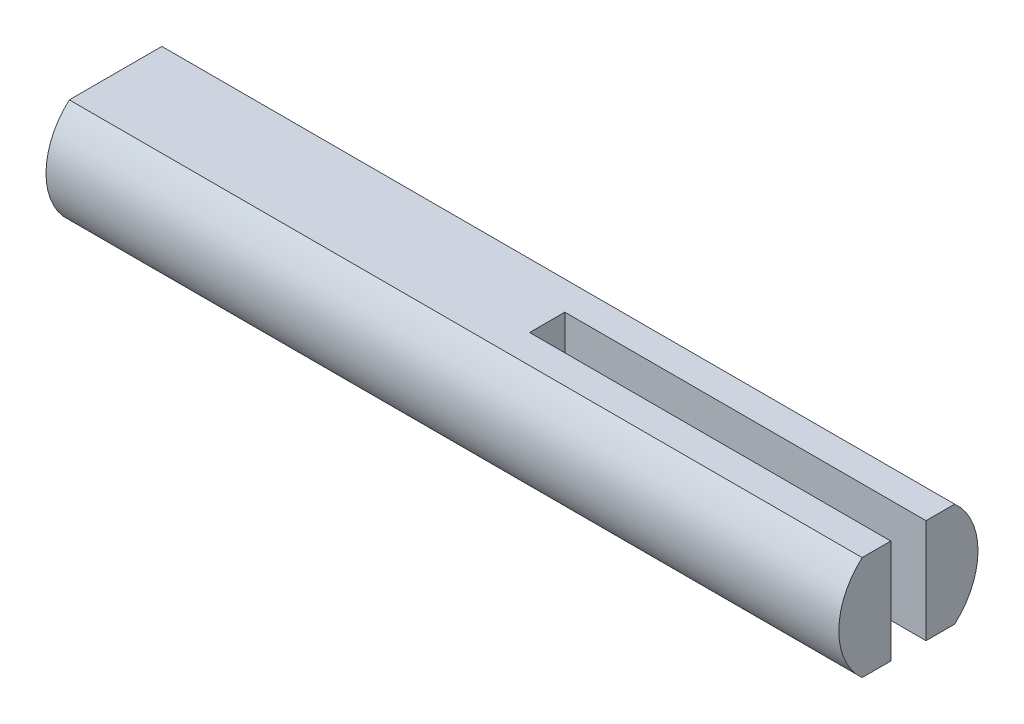
ISO-10303-21;
HEADER;
FILE_DESCRIPTION(('STEP AP214'),'2;1');
FILE_NAME('part.step','',(''),(''),'','','');
FILE_SCHEMA(('AUTOMOTIVE_DESIGN { 1 0 10303 214 1 1 1 1 }'));
ENDSEC;
DATA;
#1=APPLICATION_CONTEXT('core data for automotive mechanical design processes');
#2=APPLICATION_PROTOCOL_DEFINITION('international standard','automotive_design',2000,#1);
#3=PRODUCT_CONTEXT('',#1,'mechanical');
#4=PRODUCT('Part','Part','',(#3));
#5=PRODUCT_RELATED_PRODUCT_CATEGORY('part','',(#4));
#6=PRODUCT_DEFINITION_FORMATION('','',#4);
#7=PRODUCT_DEFINITION_CONTEXT('part definition',#1,'design');
#8=PRODUCT_DEFINITION('design','',#6,#7);
#9=PRODUCT_DEFINITION_SHAPE('','',#8);
#10=(LENGTH_UNIT() NAMED_UNIT(*) SI_UNIT(.MILLI.,.METRE.));
#11=(NAMED_UNIT(*) PLANE_ANGLE_UNIT() SI_UNIT($,.RADIAN.));
#12=(NAMED_UNIT(*) SI_UNIT($,.STERADIAN.) SOLID_ANGLE_UNIT());
#13=UNCERTAINTY_MEASURE_WITH_UNIT(LENGTH_MEASURE(1.E-05),#10,'distance_accuracy_value','');
#14=(GEOMETRIC_REPRESENTATION_CONTEXT(3) GLOBAL_UNCERTAINTY_ASSIGNED_CONTEXT((#13)) GLOBAL_UNIT_ASSIGNED_CONTEXT((#10,
#11,#12)) REPRESENTATION_CONTEXT('',''));
#15=CARTESIAN_POINT('',(0.,0.,0.));
#16=DIRECTION('',(0.,0.,1.));
#17=DIRECTION('',(1.,0.,0.));
#18=AXIS2_PLACEMENT_3D('',#15,#16,#17);
#19=CARTESIAN_POINT('',(40.5,0.,0.));
#20=DIRECTION('',(1.,0.,0.));
#21=DIRECTION('',(0.,0.,-1.));
#22=AXIS2_PLACEMENT_3D('',#19,#20,#21);
#23=PLANE('',#22);
#24=DIRECTION('',(0.,1.,0.));
#25=VECTOR('',#24,1.);
#26=CARTESIAN_POINT('',(40.5,-2.95,1.));
#27=LINE('',#26,#25);
#28=CARTESIAN_POINT('',(40.5,-2.95,1.));
#29=VERTEX_POINT('',#28);
#30=CARTESIAN_POINT('',(40.5,2.95,1.));
#31=VERTEX_POINT('',#30);
#32=EDGE_CURVE('E129',#29,#31,#27,.T.);
#33=ORIENTED_EDGE('',*,*,#32,.T.);
#34=DIRECTION('',(0.,0.,1.));
#35=VECTOR('',#34,1.);
#36=CARTESIAN_POINT('',(40.5,2.95,2.62678510731274));
#37=LINE('',#36,#35);
#38=CARTESIAN_POINT('',(40.5,2.95,2.62678510731274));
#39=VERTEX_POINT('',#38);
#40=EDGE_CURVE('E143',#31,#39,#37,.T.);
#41=ORIENTED_EDGE('',*,*,#40,.T.);
#42=CARTESIAN_POINT('',(40.5,0.,0.));
#43=DIRECTION('',(1.,0.,0.));
#44=DIRECTION('',(0.,0.,-1.));
#45=AXIS2_PLACEMENT_3D('',#42,#43,#44);
#46=CIRCLE('',#45,3.95);
#47=CARTESIAN_POINT('',(40.5,-2.95,2.62678510731274));
#48=VERTEX_POINT('',#47);
#49=EDGE_CURVE('E132',#39,#48,#46,.T.);
#50=ORIENTED_EDGE('',*,*,#49,.T.);
#51=DIRECTION('',(0.,0.,-1.));
#52=VECTOR('',#51,1.);
#53=CARTESIAN_POINT('',(40.5,-2.95,2.62678510731274));
#54=LINE('',#53,#52);
#55=EDGE_CURVE('E137',#48,#29,#54,.T.);
#56=ORIENTED_EDGE('',*,*,#55,.T.);
#57=EDGE_LOOP('',(#33,#41,#50,#56));
#58=FACE_BOUND('',#57,.T.);
#59=ADVANCED_FACE('F33',(#58),#23,.T.);
#60=CARTESIAN_POINT('',(-4.5,0.,0.));
#61=DIRECTION('',(1.,0.,0.));
#62=DIRECTION('',(0.,0.,-1.));
#63=AXIS2_PLACEMENT_3D('',#60,#61,#62);
#64=CYLINDRICAL_SURFACE('',#63,3.95);
#65=DIRECTION('',(1.,0.,0.));
#66=VECTOR('',#65,1.);
#67=CARTESIAN_POINT('',(-4.5,-2.95,2.62678510731274));
#68=LINE('',#67,#66);
#69=CARTESIAN_POINT('',(-4.5,-2.95,2.62678510731274));
#70=VERTEX_POINT('',#69);
#71=EDGE_CURVE('E37',#70,#48,#68,.T.);
#72=ORIENTED_EDGE('',*,*,#71,.T.);
#73=ORIENTED_EDGE('',*,*,#49,.F.);
#74=DIRECTION('',(1.,0.,0.));
#75=VECTOR('',#74,1.);
#76=CARTESIAN_POINT('',(-4.5,2.95,2.62678510731274));
#77=LINE('',#76,#75);
#78=CARTESIAN_POINT('',(-4.5,2.95,2.62678510731274));
#79=VERTEX_POINT('',#78);
#80=EDGE_CURVE('E11',#79,#39,#77,.T.);
#81=ORIENTED_EDGE('',*,*,#80,.F.);
#82=CARTESIAN_POINT('',(-4.5,0.,0.));
#83=DIRECTION('',(1.,0.,0.));
#84=DIRECTION('',(0.,0.,-1.));
#85=AXIS2_PLACEMENT_3D('',#82,#83,#84);
#86=CIRCLE('',#85,3.95);
#87=EDGE_CURVE('E147',#79,#70,#86,.T.);
#88=ORIENTED_EDGE('',*,*,#87,.T.);
#89=EDGE_LOOP('',(#72,#73,#81,#88));
#90=FACE_BOUND('',#89,.T.);
#91=ADVANCED_FACE('F35',(#90),#64,.T.);
#92=CARTESIAN_POINT('',(-4.5,2.95,2.62678510731274));
#93=DIRECTION('',(0.,1.,0.));
#94=DIRECTION('',(0.,0.,1.));
#95=AXIS2_PLACEMENT_3D('',#92,#93,#94);
#96=PLANE('',#95);
#97=DIRECTION('',(1.,0.,0.));
#98=VECTOR('',#97,1.);
#99=CARTESIAN_POINT('',(20.,2.95,1.));
#100=LINE('',#99,#98);
#101=CARTESIAN_POINT('',(20.,2.95,1.));
#102=VERTEX_POINT('',#101);
#103=EDGE_CURVE('E121',#102,#31,#100,.T.);
#104=ORIENTED_EDGE('',*,*,#103,.F.);
#105=DIRECTION('',(0.,0.,1.));
#106=VECTOR('',#105,1.);
#107=CARTESIAN_POINT('',(20.,2.95,1.));
#108=LINE('',#107,#106);
#109=CARTESIAN_POINT('',(20.,2.95,-0.999999999999997));
#110=VERTEX_POINT('',#109);
#111=EDGE_CURVE('E123',#110,#102,#108,.T.);
#112=ORIENTED_EDGE('',*,*,#111,.F.);
#113=DIRECTION('',(-1.,0.,0.));
#114=VECTOR('',#113,1.);
#115=CARTESIAN_POINT('',(40.5,2.95,-1.));
#116=LINE('',#115,#114);
#117=CARTESIAN_POINT('',(40.5,2.95,-1.));
#118=VERTEX_POINT('',#117);
#119=EDGE_CURVE('E102',#118,#110,#116,.T.);
#120=ORIENTED_EDGE('',*,*,#119,.F.);
#121=CARTESIAN_POINT('',(40.5,2.95,-2.62678510731274));
#122=VERTEX_POINT('',#121);
#123=EDGE_CURVE('E144',#122,#118,#37,.T.);
#124=ORIENTED_EDGE('',*,*,#123,.F.);
#125=DIRECTION('',(1.,0.,0.));
#126=VECTOR('',#125,1.);
#127=CARTESIAN_POINT('',(-4.5,2.95,-2.62678510731274));
#128=LINE('',#127,#126);
#129=CARTESIAN_POINT('',(-4.5,2.95,-2.62678510731274));
#130=VERTEX_POINT('',#129);
#131=EDGE_CURVE('E42',#130,#122,#128,.T.);
#132=ORIENTED_EDGE('',*,*,#131,.F.);
#133=DIRECTION('',(0.,0.,1.));
#134=VECTOR('',#133,1.);
#135=CARTESIAN_POINT('',(-4.5,2.95,2.62678510731274));
#136=LINE('',#135,#134);
#137=EDGE_CURVE('E155',#130,#79,#136,.T.);
#138=ORIENTED_EDGE('',*,*,#137,.T.);
#139=ORIENTED_EDGE('',*,*,#80,.T.);
#140=ORIENTED_EDGE('',*,*,#40,.F.);
#141=EDGE_LOOP('',(#104,#112,#120,#124,#132,#138,#139,#140));
#142=FACE_BOUND('',#141,.T.);
#143=ADVANCED_FACE('F166',(#142),#96,.T.);
#144=CARTESIAN_POINT('',(-4.5,0.,0.));
#145=DIRECTION('',(1.,0.,0.));
#146=DIRECTION('',(0.,0.,-1.));
#147=AXIS2_PLACEMENT_3D('',#144,#145,#146);
#148=CYLINDRICAL_SURFACE('',#147,3.95);
#149=ORIENTED_EDGE('',*,*,#131,.T.);
#150=CARTESIAN_POINT('',(40.5,0.,0.));
#151=DIRECTION('',(1.,0.,0.));
#152=DIRECTION('',(0.,0.,-1.));
#153=AXIS2_PLACEMENT_3D('',#150,#151,#152);
#154=CIRCLE('',#153,3.95);
#155=CARTESIAN_POINT('',(40.5,-2.95,-2.62678510731274));
#156=VERTEX_POINT('',#155);
#157=EDGE_CURVE('E140',#156,#122,#154,.T.);
#158=ORIENTED_EDGE('',*,*,#157,.F.);
#159=DIRECTION('',(1.,0.,0.));
#160=VECTOR('',#159,1.);
#161=CARTESIAN_POINT('',(-4.5,-2.95,-2.62678510731274));
#162=LINE('',#161,#160);
#163=CARTESIAN_POINT('',(-4.5,-2.95,-2.62678510731274));
#164=VERTEX_POINT('',#163);
#165=EDGE_CURVE('E158',#164,#156,#162,.T.);
#166=ORIENTED_EDGE('',*,*,#165,.F.);
#167=CARTESIAN_POINT('',(-4.5,0.,0.));
#168=DIRECTION('',(1.,0.,0.));
#169=DIRECTION('',(0.,0.,-1.));
#170=AXIS2_PLACEMENT_3D('',#167,#168,#169);
#171=CIRCLE('',#170,3.95);
#172=EDGE_CURVE('E152',#164,#130,#171,.T.);
#173=ORIENTED_EDGE('',*,*,#172,.T.);
#174=EDGE_LOOP('',(#149,#158,#166,#173));
#175=FACE_BOUND('',#174,.T.);
#176=ADVANCED_FACE('F173',(#175),#148,.T.);
#177=CARTESIAN_POINT('',(-4.5,-2.95,2.62678510731274));
#178=DIRECTION('',(0.,-1.,0.));
#179=DIRECTION('',(0.,0.,-1.));
#180=AXIS2_PLACEMENT_3D('',#177,#178,#179);
#181=PLANE('',#180);
#182=DIRECTION('',(1.,0.,0.));
#183=VECTOR('',#182,1.);
#184=CARTESIAN_POINT('',(20.,-2.95,1.));
#185=LINE('',#184,#183);
#186=CARTESIAN_POINT('',(20.,-2.95,1.));
#187=VERTEX_POINT('',#186);
#188=EDGE_CURVE('E115',#187,#29,#185,.T.);
#189=ORIENTED_EDGE('',*,*,#188,.T.);
#190=ORIENTED_EDGE('',*,*,#55,.F.);
#191=ORIENTED_EDGE('',*,*,#71,.F.);
#192=DIRECTION('',(0.,0.,-1.));
#193=VECTOR('',#192,1.);
#194=CARTESIAN_POINT('',(-4.5,-2.95,2.62678510731274));
#195=LINE('',#194,#193);
#196=EDGE_CURVE('E149',#70,#164,#195,.T.);
#197=ORIENTED_EDGE('',*,*,#196,.T.);
#198=ORIENTED_EDGE('',*,*,#165,.T.);
#199=CARTESIAN_POINT('',(40.5,-2.95,-1.));
#200=VERTEX_POINT('',#199);
#201=EDGE_CURVE('E120',#200,#156,#54,.T.);
#202=ORIENTED_EDGE('',*,*,#201,.F.);
#203=DIRECTION('',(-1.,0.,0.));
#204=VECTOR('',#203,1.);
#205=CARTESIAN_POINT('',(40.5,-2.95,-1.));
#206=LINE('',#205,#204);
#207=CARTESIAN_POINT('',(20.,-2.95,-0.999999999999997));
#208=VERTEX_POINT('',#207);
#209=EDGE_CURVE('E50',#200,#208,#206,.T.);
#210=ORIENTED_EDGE('',*,*,#209,.T.);
#211=DIRECTION('',(0.,0.,1.));
#212=VECTOR('',#211,1.);
#213=CARTESIAN_POINT('',(20.,-2.95,1.));
#214=LINE('',#213,#212);
#215=EDGE_CURVE('E110',#208,#187,#214,.T.);
#216=ORIENTED_EDGE('',*,*,#215,.T.);
#217=EDGE_LOOP('',(#189,#190,#191,#197,#198,#202,#210,#216));
#218=FACE_BOUND('',#217,.T.);
#219=ADVANCED_FACE('F118',(#218),#181,.T.);
#220=CARTESIAN_POINT('',(-4.5,0.,0.));
#221=DIRECTION('',(1.,0.,0.));
#222=DIRECTION('',(0.,0.,-1.));
#223=AXIS2_PLACEMENT_3D('',#220,#221,#222);
#224=PLANE('',#223);
#225=ORIENTED_EDGE('',*,*,#87,.F.);
#226=ORIENTED_EDGE('',*,*,#137,.F.);
#227=ORIENTED_EDGE('',*,*,#172,.F.);
#228=ORIENTED_EDGE('',*,*,#196,.F.);
#229=EDGE_LOOP('',(#225,#226,#227,#228));
#230=FACE_BOUND('',#229,.T.);
#231=ADVANCED_FACE('F171',(#230),#224,.F.);
#232=DIRECTION('',(0.,1.,0.));
#233=VECTOR('',#232,1.);
#234=CARTESIAN_POINT('',(40.5,-2.95,-1.));
#235=LINE('',#234,#233);
#236=EDGE_CURVE('E107',#200,#118,#235,.T.);
#237=ORIENTED_EDGE('',*,*,#236,.F.);
#238=ORIENTED_EDGE('',*,*,#201,.T.);
#239=ORIENTED_EDGE('',*,*,#157,.T.);
#240=ORIENTED_EDGE('',*,*,#123,.T.);
#241=EDGE_LOOP('',(#237,#238,#239,#240));
#242=FACE_BOUND('',#241,.T.);
#243=ADVANCED_FACE('F175',(#242),#23,.T.);
#244=CARTESIAN_POINT('',(20.,-2.95,1.));
#245=DIRECTION('',(0.,0.,1.));
#246=DIRECTION('',(1.,0.,0.));
#247=AXIS2_PLACEMENT_3D('',#244,#245,#246);
#248=PLANE('',#247);
#249=ORIENTED_EDGE('',*,*,#103,.T.);
#250=ORIENTED_EDGE('',*,*,#32,.F.);
#251=ORIENTED_EDGE('',*,*,#188,.F.);
#252=DIRECTION('',(0.,1.,0.));
#253=VECTOR('',#252,1.);
#254=CARTESIAN_POINT('',(20.,-2.95,1.));
#255=LINE('',#254,#253);
#256=EDGE_CURVE('E106',#187,#102,#255,.T.);
#257=ORIENTED_EDGE('',*,*,#256,.T.);
#258=EDGE_LOOP('',(#249,#250,#251,#257));
#259=FACE_BOUND('',#258,.T.);
#260=ADVANCED_FACE('F177',(#259),#248,.F.);
#261=CARTESIAN_POINT('',(20.,-2.95,1.));
#262=DIRECTION('',(-1.,0.,0.));
#263=DIRECTION('',(0.,0.,1.));
#264=AXIS2_PLACEMENT_3D('',#261,#262,#263);
#265=PLANE('',#264);
#266=ORIENTED_EDGE('',*,*,#111,.T.);
#267=ORIENTED_EDGE('',*,*,#256,.F.);
#268=ORIENTED_EDGE('',*,*,#215,.F.);
#269=DIRECTION('',(0.,1.,0.));
#270=VECTOR('',#269,1.);
#271=CARTESIAN_POINT('',(20.,-2.95,-0.999999999999997));
#272=LINE('',#271,#270);
#273=EDGE_CURVE('E98',#208,#110,#272,.T.);
#274=ORIENTED_EDGE('',*,*,#273,.T.);
#275=EDGE_LOOP('',(#266,#267,#268,#274));
#276=FACE_BOUND('',#275,.T.);
#277=ADVANCED_FACE('F111',(#276),#265,.F.);
#278=CARTESIAN_POINT('',(40.5,-2.95,-1.));
#279=DIRECTION('',(0.,0.,-1.));
#280=DIRECTION('',(-1.,0.,0.));
#281=AXIS2_PLACEMENT_3D('',#278,#279,#280);
#282=PLANE('',#281);
#283=ORIENTED_EDGE('',*,*,#119,.T.);
#284=ORIENTED_EDGE('',*,*,#273,.F.);
#285=ORIENTED_EDGE('',*,*,#209,.F.);
#286=ORIENTED_EDGE('',*,*,#236,.T.);
#287=EDGE_LOOP('',(#283,#284,#285,#286));
#288=FACE_BOUND('',#287,.T.);
#289=ADVANCED_FACE('F100',(#288),#282,.F.);
#290=CLOSED_SHELL('',(#59,#91,#143,#176,#219,#231,#243,#260,#277,#289));
#291=MANIFOLD_SOLID_BREP('B2',#290);
#292=ADVANCED_BREP_SHAPE_REPRESENTATION('',(#18,#291),#14);
#293=SHAPE_DEFINITION_REPRESENTATION(#9,#292);
ENDSEC;
END-ISO-10303-21;
